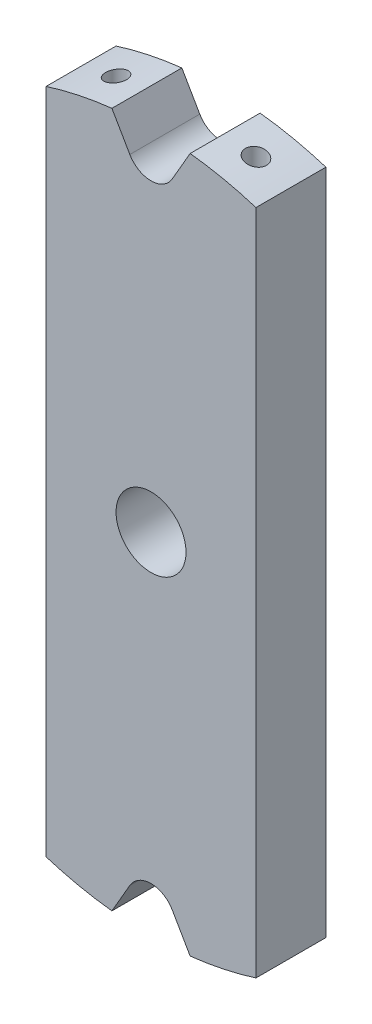
ISO-10303-21;
HEADER;
FILE_DESCRIPTION(('STEP AP214'),'2;1');
FILE_NAME('part.step','',(''),(''),'','','');
FILE_SCHEMA(('AUTOMOTIVE_DESIGN { 1 0 10303 214 1 1 1 1 }'));
ENDSEC;
DATA;
#1=APPLICATION_CONTEXT('core data for automotive mechanical design processes');
#2=APPLICATION_PROTOCOL_DEFINITION('international standard','automotive_design',2000,#1);
#3=PRODUCT_CONTEXT('',#1,'mechanical');
#4=PRODUCT('Part','Part','',(#3));
#5=PRODUCT_RELATED_PRODUCT_CATEGORY('part','',(#4));
#6=PRODUCT_DEFINITION_FORMATION('','',#4);
#7=PRODUCT_DEFINITION_CONTEXT('part definition',#1,'design');
#8=PRODUCT_DEFINITION('design','',#6,#7);
#9=PRODUCT_DEFINITION_SHAPE('','',#8);
#10=(LENGTH_UNIT() NAMED_UNIT(*) SI_UNIT(.MILLI.,.METRE.));
#11=(NAMED_UNIT(*) PLANE_ANGLE_UNIT() SI_UNIT($,.RADIAN.));
#12=(NAMED_UNIT(*) SI_UNIT($,.STERADIAN.) SOLID_ANGLE_UNIT());
#13=UNCERTAINTY_MEASURE_WITH_UNIT(LENGTH_MEASURE(1.E-05),#10,'distance_accuracy_value','');
#14=(GEOMETRIC_REPRESENTATION_CONTEXT(3) GLOBAL_UNCERTAINTY_ASSIGNED_CONTEXT((#13)) GLOBAL_UNIT_ASSIGNED_CONTEXT((#10,
#11,#12)) REPRESENTATION_CONTEXT('',''));
#15=CARTESIAN_POINT('',(0.,0.,0.));
#16=DIRECTION('',(0.,0.,1.));
#17=DIRECTION('',(1.,0.,0.));
#18=AXIS2_PLACEMENT_3D('',#15,#16,#17);
#19=CARTESIAN_POINT('',(0.,-47.,10.));
#20=DIRECTION('',(0.,0.,-1.));
#21=DIRECTION('',(-1.,0.,0.));
#22=AXIS2_PLACEMENT_3D('',#19,#20,#21);
#23=CYLINDRICAL_SURFACE('',#22,3.5);
#24=CARTESIAN_POINT('',(0.,-47.,0.));
#25=DIRECTION('',(0.,0.,1.));
#26=DIRECTION('',(1.,0.,0.));
#27=AXIS2_PLACEMENT_3D('',#24,#25,#26);
#28=CIRCLE('',#27,3.5);
#29=CARTESIAN_POINT('',(3.03108891324553,-45.25,0.));
#30=VERTEX_POINT('',#29);
#31=CARTESIAN_POINT('',(-3.03108891324553,-45.25,0.));
#32=VERTEX_POINT('',#31);
#33=EDGE_CURVE('E182',#30,#32,#28,.T.);
#34=ORIENTED_EDGE('',*,*,#33,.F.);
#35=DIRECTION('',(0.,0.,-1.));
#36=VECTOR('',#35,1.);
#37=CARTESIAN_POINT('',(3.03108891324553,-45.25,10.));
#38=LINE('',#37,#36);
#39=CARTESIAN_POINT('',(3.03108891324553,-45.25,10.));
#40=VERTEX_POINT('',#39);
#41=EDGE_CURVE('E11',#40,#30,#38,.T.);
#42=ORIENTED_EDGE('',*,*,#41,.F.);
#43=CARTESIAN_POINT('',(0.,-47.,10.));
#44=DIRECTION('',(0.,0.,1.));
#45=DIRECTION('',(1.,0.,0.));
#46=AXIS2_PLACEMENT_3D('',#43,#44,#45);
#47=CIRCLE('',#46,3.5);
#48=CARTESIAN_POINT('',(-3.03108891324553,-45.25,10.));
#49=VERTEX_POINT('',#48);
#50=EDGE_CURVE('E170',#40,#49,#47,.T.);
#51=ORIENTED_EDGE('',*,*,#50,.T.);
#52=DIRECTION('',(0.,0.,-1.));
#53=VECTOR('',#52,1.);
#54=CARTESIAN_POINT('',(-3.03108891324553,-45.25,10.));
#55=LINE('',#54,#53);
#56=EDGE_CURVE('E60',#49,#32,#55,.T.);
#57=ORIENTED_EDGE('',*,*,#56,.T.);
#58=EDGE_LOOP('',(#34,#42,#51,#57));
#59=FACE_BOUND('',#58,.T.);
#60=ADVANCED_FACE('F37',(#59),#23,.F.);
#61=CARTESIAN_POINT('',(-17.3205080756888,-10.0000000000001,10.));
#62=DIRECTION('',(0.866025403784438,0.500000000000002,0.));
#63=DIRECTION('',(-0.500000000000002,0.866025403784438,0.));
#64=AXIS2_PLACEMENT_3D('',#61,#62,#63);
#65=PLANE('',#64);
#66=DIRECTION('',(0.500000000000002,-0.866025403784438,0.));
#67=VECTOR('',#66,1.);
#68=CARTESIAN_POINT('',(-17.3205080756888,-10.0000000000001,0.));
#69=LINE('',#68,#67);
#70=CARTESIAN_POINT('',(5.59237039909043,-49.6862696659689,0.));
#71=VERTEX_POINT('',#70);
#72=EDGE_CURVE('E224',#30,#71,#69,.T.);
#73=ORIENTED_EDGE('',*,*,#72,.T.);
#74=DIRECTION('',(0.,0.,-1.));
#75=VECTOR('',#74,1.);
#76=CARTESIAN_POINT('',(5.59237039909043,-49.6862696659689,10.));
#77=LINE('',#76,#75);
#78=CARTESIAN_POINT('',(5.59237039909043,-49.6862696659689,10.));
#79=VERTEX_POINT('',#78);
#80=EDGE_CURVE('E51',#79,#71,#77,.T.);
#81=ORIENTED_EDGE('',*,*,#80,.F.);
#82=DIRECTION('',(0.500000000000002,-0.866025403784438,0.));
#83=VECTOR('',#82,1.);
#84=CARTESIAN_POINT('',(-17.3205080756888,-10.0000000000001,10.));
#85=LINE('',#84,#83);
#86=EDGE_CURVE('E164',#40,#79,#85,.T.);
#87=ORIENTED_EDGE('',*,*,#86,.F.);
#88=ORIENTED_EDGE('',*,*,#41,.T.);
#89=EDGE_LOOP('',(#73,#81,#87,#88));
#90=FACE_BOUND('',#89,.T.);
#91=ADVANCED_FACE('F216',(#90),#65,.F.);
#92=CARTESIAN_POINT('',(0.,0.,10.));
#93=DIRECTION('',(0.,0.,-1.));
#94=DIRECTION('',(-1.,0.,0.));
#95=AXIS2_PLACEMENT_3D('',#92,#93,#94);
#96=CYLINDRICAL_SURFACE('',#95,50.);
#97=CARTESIAN_POINT('',(10.,-48.9897948556635,6.5));
#98=CARTESIAN_POINT('',(10.0858791366832,-48.9722645101697,6.49999635952128));
#99=CARTESIAN_POINT('',(10.171775363064,-48.9544936081864,6.49260226758872));
#100=CARTESIAN_POINT('',(10.3411286938173,-48.9190000824482,6.46322747399532));
#101=CARTESIAN_POINT('',(10.4245825439414,-48.9012775493037,6.44122816049135));
#102=CARTESIAN_POINT('',(10.5866005320511,-48.8664583646854,6.38322024386198));
#103=CARTESIAN_POINT('',(10.6651657898896,-48.849361570243,6.34721486297893));
#104=CARTESIAN_POINT('',(10.8151282587911,-48.8163794425489,6.26213937319581));
#105=CARTESIAN_POINT('',(10.8865275357104,-48.8004937604691,6.21307304457599));
#106=CARTESIAN_POINT('',(11.0195888455761,-48.7706191018605,6.10354533187251));
#107=CARTESIAN_POINT('',(11.0813144698965,-48.7566178320047,6.04316463903699));
#108=CARTESIAN_POINT('',(11.1936978075733,-48.7309394665944,5.91242200892849));
#109=CARTESIAN_POINT('',(11.2443563260133,-48.7192622019842,5.84206079830924));
#110=CARTESIAN_POINT('',(11.3319739958824,-48.6989563703661,5.69499015485189));
#111=CARTESIAN_POINT('',(11.3692088289329,-48.6902666458524,5.61845346265767));
#112=CARTESIAN_POINT('',(11.4302686257909,-48.675968917627,5.45993699606161));
#113=CARTESIAN_POINT('',(11.4540957354442,-48.670360420782,5.37795809501017));
#114=CARTESIAN_POINT('',(11.4871196473488,-48.6625766397147,5.21302096788956));
#115=CARTESIAN_POINT('',(11.4966568090315,-48.6603214952865,5.13013454711988));
#116=CARTESIAN_POINT('',(11.5018688822255,-48.6590898060923,4.96390629057573));
#117=CARTESIAN_POINT('',(11.4975450683311,-48.6601129598683,4.88056449737885));
#118=CARTESIAN_POINT('',(11.4753203607744,-48.6653588041587,4.71685367699029));
#119=CARTESIAN_POINT('',(11.4575848832894,-48.6695425125373,4.6364608465482));
#120=CARTESIAN_POINT('',(11.4093088609983,-48.6808820910527,4.4798422263389));
#121=CARTESIAN_POINT('',(11.3787680772939,-48.6880380166397,4.40361651434425));
#122=CARTESIAN_POINT('',(11.3055766282569,-48.7050854842078,4.2568709445758));
#123=CARTESIAN_POINT('',(11.2628410380735,-48.7149961975756,4.18639572259919));
#124=CARTESIAN_POINT('',(11.1666454346378,-48.737136342327,4.05360556168745));
#125=CARTESIAN_POINT('',(11.1131843440286,-48.749366006638,3.99129144356034));
#126=CARTESIAN_POINT('',(10.9958096234631,-48.7759762744799,3.8751323176183));
#127=CARTESIAN_POINT('',(10.9316941602923,-48.7903978319001,3.82150069015058));
#128=CARTESIAN_POINT('',(10.795695519945,-48.8206698688679,3.72572029550702));
#129=CARTESIAN_POINT('',(10.7238113527117,-48.8365205305004,3.683572994329));
#130=CARTESIAN_POINT('',(10.5724474432344,-48.8695149240269,3.61092945441263));
#131=CARTESIAN_POINT('',(10.4928273148715,-48.8866804950205,3.58073546476346));
#132=CARTESIAN_POINT('',(10.3297112477514,-48.9214065316062,3.5342289525659));
#133=CARTESIAN_POINT('',(10.2462149579455,-48.9389670328909,3.51791768991794));
#134=CARTESIAN_POINT('',(10.0764583822101,-48.9742034276424,3.49948557529662));
#135=CARTESIAN_POINT('',(9.99017578489304,-48.9918775115893,3.49756592895371));
#136=CARTESIAN_POINT('',(9.81842508726328,-49.0265867259597,3.50854590114569));
#137=CARTESIAN_POINT('',(9.73295699753433,-49.0436218480889,3.52144571198219));
#138=CARTESIAN_POINT('',(9.56538904364483,-49.0765791304875,3.56176123191633));
#139=CARTESIAN_POINT('',(9.48328559575749,-49.0925024883476,3.58916103979063));
#140=CARTESIAN_POINT('',(9.32477622025261,-49.1228568538973,3.65778913034384));
#141=CARTESIAN_POINT('',(9.24836994980716,-49.137287951404,3.69901658012162));
#142=CARTESIAN_POINT('',(9.104517257283,-49.1641440413254,3.7935902143637));
#143=CARTESIAN_POINT('',(9.03696796226519,-49.1765925123405,3.84677319580919));
#144=CARTESIAN_POINT('',(8.91176058474239,-49.1994368014648,3.96409788462003));
#145=CARTESIAN_POINT('',(8.85410158990014,-49.209832808918,4.02823858009316));
#146=CARTESIAN_POINT('',(8.75137555093064,-49.2282044283432,4.16448103291895));
#147=CARTESIAN_POINT('',(8.7061105834476,-49.2362182843981,4.23642841574585));
#148=CARTESIAN_POINT('',(8.62830455130649,-49.2499129826269,4.38710606472149));
#149=CARTESIAN_POINT('',(8.59576240246438,-49.2555940235954,4.46583575221327));
#150=CARTESIAN_POINT('',(8.54479980823417,-49.2644604176461,4.62663079364835));
#151=CARTESIAN_POINT('',(8.52618449568467,-49.2676802232981,4.70863252536448));
#152=CARTESIAN_POINT('',(8.50289877509364,-49.2717044052351,4.87464959868988));
#153=CARTESIAN_POINT('',(8.49822765151238,-49.2725089054605,4.95866483675396));
#154=CARTESIAN_POINT('',(8.50295715004735,-49.2716929298714,5.1256429516356));
#155=CARTESIAN_POINT('',(8.51225089738638,-49.2700908717547,5.20860897046305));
#156=CARTESIAN_POINT('',(8.54442614620231,-49.2645211599643,5.37177880875471));
#157=CARTESIAN_POINT('',(8.56730750871162,-49.2605535304846,5.45198265646021));
#158=CARTESIAN_POINT('',(8.62596751232278,-49.2503153827811,5.60740154847636));
#159=CARTESIAN_POINT('',(8.66175110929415,-49.2440439796389,5.68261466263724));
#160=CARTESIAN_POINT('',(8.74512876652254,-49.2293053743931,5.82593696775097));
#161=CARTESIAN_POINT('',(8.79272268540993,-49.2208381985728,5.89404624372296));
#162=CARTESIAN_POINT('',(8.89873500362245,-49.2017828033848,6.02184332688862));
#163=CARTESIAN_POINT('',(8.95723764833153,-49.1911780203213,6.08145874538407));
#164=CARTESIAN_POINT('',(9.08310525326399,-49.1680921477138,6.19004825601408));
#165=CARTESIAN_POINT('',(9.15047295234948,-49.1556104781342,6.23901904703668));
#166=CARTESIAN_POINT('',(9.29317681734923,-49.1288327680158,6.32569839438116));
#167=CARTESIAN_POINT('',(9.36861658145366,-49.1145125069087,6.36322864612664));
#168=CARTESIAN_POINT('',(9.52441028389691,-49.0845380786996,6.42507020798071));
#169=CARTESIAN_POINT('',(9.60475883807431,-49.0688853659247,6.44939572194411));
#170=CARTESIAN_POINT('',(9.73798331829622,-49.0425780240097,6.4778815345245));
#171=CARTESIAN_POINT('',(9.79007003758203,-49.0322075628501,6.48616965076817));
#172=CARTESIAN_POINT('',(9.89476903019442,-49.0111864567158,6.49723001853622));
#173=CARTESIAN_POINT('',(9.94738130728341,-49.0005358097344,6.50000223054445));
#174=CARTESIAN_POINT('',(10.,-48.9897948556635,6.5));
#175=B_SPLINE_CURVE_WITH_KNOTS('',3,(#97,#98,#99,#100,#101,#102,#103,#104,#105,#106,#107,#108,
#109,#110,#111,#112,#113,#114,#115,#116,#117,#118,#119,#120,#121,#122,#123,#124,#125,#126,#127,
#128,#129,#130,#131,#132,#133,#134,#135,#136,#137,#138,#139,#140,#141,#142,#143,#144,#145,#146,
#147,#148,#149,#150,#151,#152,#153,#154,#155,#156,#157,#158,#159,#160,#161,#162,#163,#164,#165,
#166,#167,#168,#169,#170,#171,#172,#173,#174),.UNSPECIFIED.,.T.,.F.,(4,2,2,2,2,2,2,2,2,2,2,2,2,
2,2,2,2,2,2,2,2,2,2,2,2,2,2,2,2,2,2,2,2,2,2,2,2,2,4),(0.,0.262754956183761,0.525845392733657,
0.788875338338123,1.05182923679747,1.31297464985277,1.57410105938678,1.82950966904126,
2.0848773900599,2.33406028359135,2.58322026401755,2.82935629478026,3.0754969177092,
3.32339534846435,3.57131869264088,3.82462768746647,4.07796900257275,4.33735986788656,
4.59677427121445,4.85980883727825,5.12284681659378,5.38559693484838,5.64833122932191,
5.90767603850909,6.1669969113824,6.42189655348526,6.67677446939714,6.92801571975663,
7.17924407756359,7.42855952335793,7.6778724193176,7.92728118089956,8.17668695720117,
8.42810522423618,8.67960135021653,8.9348373595731,9.18979827407029,9.35078875191499,
9.51178038309772),.UNSPECIFIED.);
#176=CARTESIAN_POINT('',(10.,-48.9897948556635,6.5));
#177=VERTEX_POINT('',#176);
#178=EDGE_CURVE('E175',#177,#177,#175,.T.);
#179=ORIENTED_EDGE('',*,*,#178,.T.);
#180=EDGE_LOOP('',(#179));
#181=FACE_BOUND('',#180,.T.);
#182=CARTESIAN_POINT('',(0.,0.,0.));
#183=DIRECTION('',(0.,0.,1.));
#184=DIRECTION('',(1.,0.,0.));
#185=AXIS2_PLACEMENT_3D('',#182,#183,#184);
#186=CIRCLE('',#185,50.);
#187=CARTESIAN_POINT('',(15.,-47.6969600708473,0.));
#188=VERTEX_POINT('',#187);
#189=EDGE_CURVE('E226',#71,#188,#186,.T.);
#190=ORIENTED_EDGE('',*,*,#189,.T.);
#191=DIRECTION('',(0.,0.,-1.));
#192=VECTOR('',#191,1.);
#193=CARTESIAN_POINT('',(15.,-47.6969600708473,10.));
#194=LINE('',#193,#192);
#195=CARTESIAN_POINT('',(15.,-47.6969600708473,10.));
#196=VERTEX_POINT('',#195);
#197=EDGE_CURVE('E263',#196,#188,#194,.T.);
#198=ORIENTED_EDGE('',*,*,#197,.F.);
#199=CARTESIAN_POINT('',(0.,0.,10.));
#200=DIRECTION('',(0.,0.,1.));
#201=DIRECTION('',(1.,0.,0.));
#202=AXIS2_PLACEMENT_3D('',#199,#200,#201);
#203=CIRCLE('',#202,50.);
#204=EDGE_CURVE('E159',#79,#196,#203,.T.);
#205=ORIENTED_EDGE('',*,*,#204,.F.);
#206=ORIENTED_EDGE('',*,*,#80,.T.);
#207=EDGE_LOOP('',(#190,#198,#205,#206));
#208=FACE_BOUND('',#207,.T.);
#209=ADVANCED_FACE('F214',(#181,#208),#96,.T.);
#210=CARTESIAN_POINT('',(15.,0.,10.));
#211=DIRECTION('',(1.,0.,0.));
#212=DIRECTION('',(0.,0.,-1.));
#213=AXIS2_PLACEMENT_3D('',#210,#211,#212);
#214=PLANE('',#213);
#215=DIRECTION('',(0.,-1.,0.));
#216=VECTOR('',#215,1.);
#217=CARTESIAN_POINT('',(15.,0.,0.));
#218=LINE('',#217,#216);
#219=CARTESIAN_POINT('',(15.,47.6969600708473,0.));
#220=VERTEX_POINT('',#219);
#221=EDGE_CURVE('E231',#220,#188,#218,.T.);
#222=ORIENTED_EDGE('',*,*,#221,.F.);
#223=DIRECTION('',(0.,0.,-1.));
#224=VECTOR('',#223,1.);
#225=CARTESIAN_POINT('',(15.,47.6969600708473,10.));
#226=LINE('',#225,#224);
#227=CARTESIAN_POINT('',(15.,47.6969600708473,10.));
#228=VERTEX_POINT('',#227);
#229=EDGE_CURVE('E261',#228,#220,#226,.T.);
#230=ORIENTED_EDGE('',*,*,#229,.F.);
#231=DIRECTION('',(0.,-1.,0.));
#232=VECTOR('',#231,1.);
#233=CARTESIAN_POINT('',(15.,0.,10.));
#234=LINE('',#233,#232);
#235=EDGE_CURVE('E163',#228,#196,#234,.T.);
#236=ORIENTED_EDGE('',*,*,#235,.T.);
#237=ORIENTED_EDGE('',*,*,#197,.T.);
#238=EDGE_LOOP('',(#222,#230,#236,#237));
#239=FACE_BOUND('',#238,.T.);
#240=ADVANCED_FACE('F399',(#239),#214,.T.);
#241=CARTESIAN_POINT('',(0.,0.,10.));
#242=DIRECTION('',(0.,0.,-1.));
#243=DIRECTION('',(-1.,0.,0.));
#244=AXIS2_PLACEMENT_3D('',#241,#242,#243);
#245=CYLINDRICAL_SURFACE('',#244,50.);
#246=CARTESIAN_POINT('',(10.,48.9897948556635,6.5));
#247=CARTESIAN_POINT('',(9.91478887554006,49.0071881811933,6.49999647971611));
#248=CARTESIAN_POINT('',(9.82947274865342,49.0243695659367,6.49271742395125));
#249=CARTESIAN_POINT('',(9.66107570232554,49.0578333106574,6.46370932867217));
#250=CARTESIAN_POINT('',(9.57799742092414,49.0741146315172,6.44196395026409));
#251=CARTESIAN_POINT('',(9.41652208231213,49.1053548559542,6.38451954869199));
#252=CARTESIAN_POINT('',(9.33812559406634,49.1203135989081,6.34881883353796));
#253=CARTESIAN_POINT('',(9.18838467540367,49.14854422101,6.26438380204273));
#254=CARTESIAN_POINT('',(9.1170382563951,49.1618165761361,6.2156531754642));
#255=CARTESIAN_POINT('',(8.98431772906986,49.1862434549037,6.10709344498023));
#256=CARTESIAN_POINT('',(8.92283973739132,49.1974202819408,6.04739642373511));
#257=CARTESIAN_POINT('',(8.81078991056041,49.217610986253,5.91819901467924));
#258=CARTESIAN_POINT('',(8.76021753161179,49.2266249713783,5.84869911596406));
#259=CARTESIAN_POINT('',(8.67232737510407,49.2421841935953,5.70313089654968));
#260=CARTESIAN_POINT('',(8.63480120565231,49.2487683593233,5.6271925318511));
#261=CARTESIAN_POINT('',(8.57301363506163,49.259561788017,5.46994102269112));
#262=CARTESIAN_POINT('',(8.54875117647063,49.2637712403082,5.38862830728046));
#263=CARTESIAN_POINT('',(8.51447377685327,49.2697071016662,5.22403263081471));
#264=CARTESIAN_POINT('',(8.5042842247487,49.2714639447555,5.14078709340706));
#265=CARTESIAN_POINT('',(8.49790291166978,49.2725649590369,4.97374689722054));
#266=CARTESIAN_POINT('',(8.50171055443912,49.2719092330001,4.88995226198407));
#267=CARTESIAN_POINT('',(8.52314690741033,49.2682055854702,4.72465564512902));
#268=CARTESIAN_POINT('',(8.54070283020577,49.2651702621672,4.64314392425489));
#269=CARTESIAN_POINT('',(8.58900623305097,49.2567717985695,4.48425654649366));
#270=CARTESIAN_POINT('',(8.61975371843793,49.2514086573329,4.40688089127999));
#271=CARTESIAN_POINT('',(8.69360927156552,49.2384256503157,4.25821026134585));
#272=CARTESIAN_POINT('',(8.73675165951313,49.2307995165887,4.18693289331001));
#273=CARTESIAN_POINT('',(8.83406582238714,49.2134302433338,4.0526488910847));
#274=CARTESIAN_POINT('',(8.88823803585944,49.2036870196292,3.9896425859166));
#275=CARTESIAN_POINT('',(9.00662904619383,49.1821540974586,3.87297206796926));
#276=CARTESIAN_POINT('',(9.07094559081054,49.1703443508452,3.81941078104238));
#277=CARTESIAN_POINT('',(9.2073373750036,49.1449869654042,3.72382499452799));
#278=CARTESIAN_POINT('',(9.27941319537721,49.1314391964675,3.68180135939377));
#279=CARTESIAN_POINT('',(9.43045983014779,49.1026722544835,3.60977214847654));
#280=CARTESIAN_POINT('',(9.50952095694066,49.0874302263229,3.57996511669569));
#281=CARTESIAN_POINT('',(9.67130669628057,49.0558112655786,3.53404169782797));
#282=CARTESIAN_POINT('',(9.75403164585665,49.0394342285088,3.5179265730007));
#283=CARTESIAN_POINT('',(9.92223683268529,49.0056801861247,3.49959127754888));
#284=CARTESIAN_POINT('',(10.0077400068686,48.9882911870315,3.49760328944522));
#285=CARTESIAN_POINT('',(10.177794242512,48.9532434500547,3.50813936648569));
#286=CARTESIAN_POINT('',(10.2623452310211,48.9355846917448,3.52066453600949));
#287=CARTESIAN_POINT('',(10.4289846852894,48.9003436119754,3.56007808250217));
#288=CARTESIAN_POINT('',(10.5110400542204,48.8827638224671,3.5871088950929));
#289=CARTESIAN_POINT('',(10.6694535694822,48.8484322709889,3.6549145269799));
#290=CARTESIAN_POINT('',(10.7458116544822,48.8316805179335,3.69568949420484));
#291=CARTESIAN_POINT('',(10.8903509269333,48.7996488224022,3.78975843904898));
#292=CARTESIAN_POINT('',(10.9585591393729,48.7843640505829,3.84300920311653));
#293=CARTESIAN_POINT('',(11.0850306972285,48.7557822847538,3.96068922830953));
#294=CARTESIAN_POINT('',(11.1432949452544,48.7424851103441,4.0251174737876));
#295=CARTESIAN_POINT('',(11.2470602023482,48.7186455879108,4.16209329890533));
#296=CARTESIAN_POINT('',(11.2927757456295,48.708057177447,4.23447024596363));
#297=CARTESIAN_POINT('',(11.3713451956066,48.689774533382,4.3862329725378));
#298=CARTESIAN_POINT('',(11.404201131811,48.6820798431002,4.46561764366618));
#299=CARTESIAN_POINT('',(11.4552848942714,48.6700844822706,4.62699917964206));
#300=CARTESIAN_POINT('',(11.4738591829755,48.6657034703804,4.70888046709156));
#301=CARTESIAN_POINT('',(11.4970991515116,48.6602184271968,4.87469838160647));
#302=CARTESIAN_POINT('',(11.5017664833735,48.6591140066717,4.95863476334943));
#303=CARTESIAN_POINT('',(11.4970782220618,48.6602219050326,5.12462685362414));
#304=CARTESIAN_POINT('',(11.4879647119167,48.6623769659467,5.20668991091699));
#305=CARTESIAN_POINT('',(11.456461115543,48.6698033418085,5.36807660393447));
#306=CARTESIAN_POINT('',(11.4340712177784,48.6750746125201,5.44740027852888));
#307=CARTESIAN_POINT('',(11.3767108931329,48.688513137101,5.60117205164938));
#308=CARTESIAN_POINT('',(11.3417293161195,48.6966829575898,5.67561575960253));
#309=CARTESIAN_POINT('',(11.2602751435931,48.7155821552456,5.81755964595221));
#310=CARTESIAN_POINT('',(11.2138020914377,48.7263116341264,5.8850595482684));
#311=CARTESIAN_POINT('',(11.1098026235503,48.7501299974904,6.01253453224992));
#312=CARTESIAN_POINT('',(11.0520918433019,48.7632579719427,6.07235180740386));
#313=CARTESIAN_POINT('',(10.9278330749031,48.7912544843515,6.18151094791257));
#314=CARTESIAN_POINT('',(10.86128186333,48.8061236569533,6.23084897515932));
#315=CARTESIAN_POINT('',(10.7194336434795,48.8374768565917,6.31892412838511));
#316=CARTESIAN_POINT('',(10.6439587541398,48.8539920952489,6.35736338723341));
#317=CARTESIAN_POINT('',(10.4878284039359,48.8877470521233,6.42095586158039));
#318=CARTESIAN_POINT('',(10.4071784210435,48.9049859978043,6.44612287412656));
#319=CARTESIAN_POINT('',(10.2717399946764,48.9335707241887,6.4761934763488));
#320=CARTESIAN_POINT('',(10.2177970565818,48.9448638256713,6.4851078016435));
#321=CARTESIAN_POINT('',(10.1092504803561,48.967398626134,6.49701223426897));
#322=CARTESIAN_POINT('',(10.0546468328677,48.978640324383,6.50000225759684));
#323=CARTESIAN_POINT('',(10.,48.9897948556635,6.5));
#324=B_SPLINE_CURVE_WITH_KNOTS('',3,(#246,#247,#248,#249,#250,#251,#252,#253,#254,#255,#256,
#257,#258,#259,#260,#261,#262,#263,#264,#265,#266,#267,#268,#269,#270,#271,#272,#273,#274,#275,
#276,#277,#278,#279,#280,#281,#282,#283,#284,#285,#286,#287,#288,#289,#290,#291,#292,#293,#294,
#295,#296,#297,#298,#299,#300,#301,#302,#303,#304,#305,#306,#307,#308,#309,#310,#311,#312,#313,
#314,#315,#316,#317,#318,#319,#320,#321,#322,#323),.UNSPECIFIED.,.T.,.F.,(4,2,2,2,2,2,2,2,2,2,2,
2,2,2,2,2,2,2,2,2,2,2,2,2,2,2,2,2,2,2,2,2,2,2,2,2,2,2,4),(0.,0.260704172880814,
0.521703297429954,0.782734076174067,1.0436910153161,1.3016895713054,1.55967525950698,
1.81332705298739,2.06695862107605,2.31741406537969,2.5678588408379,2.8169865795378,
3.0661144190324,3.3159388279527,3.5657731718326,3.81818123120511,4.07060819697824,
4.32698884109619,4.58339311843225,4.84400190946332,5.10463053283968,5.36786647783089,
5.63110525612741,5.89344537010953,6.1557616589006,6.4132657359251,6.6707291571463,
6.92173031678122,7.17270165839014,7.41931520245745,7.66592524582648,7.9127542057235,
8.1595929755592,8.41088698352997,8.66227287182458,8.9199820193061,9.17742273677064,
9.34461282432342,9.51180528251023),.UNSPECIFIED.);
#325=CARTESIAN_POINT('',(10.,48.9897948556635,6.5));
#326=VERTEX_POINT('',#325);
#327=EDGE_CURVE('E40',#326,#326,#324,.T.);
#328=ORIENTED_EDGE('',*,*,#327,.T.);
#329=EDGE_LOOP('',(#328));
#330=FACE_BOUND('',#329,.T.);
#331=CARTESIAN_POINT('',(0.,0.,0.));
#332=DIRECTION('',(0.,0.,1.));
#333=DIRECTION('',(1.,0.,0.));
#334=AXIS2_PLACEMENT_3D('',#331,#332,#333);
#335=CIRCLE('',#334,50.);
#336=CARTESIAN_POINT('',(5.59237039909043,49.6862696659689,0.));
#337=VERTEX_POINT('',#336);
#338=EDGE_CURVE('E235',#220,#337,#335,.T.);
#339=ORIENTED_EDGE('',*,*,#338,.T.);
#340=DIRECTION('',(0.,0.,-1.));
#341=VECTOR('',#340,1.);
#342=CARTESIAN_POINT('',(5.59237039909043,49.6862696659689,10.));
#343=LINE('',#342,#341);
#344=CARTESIAN_POINT('',(5.59237039909043,49.6862696659689,10.));
#345=VERTEX_POINT('',#344);
#346=EDGE_CURVE('E259',#345,#337,#343,.T.);
#347=ORIENTED_EDGE('',*,*,#346,.F.);
#348=CARTESIAN_POINT('',(0.,0.,10.));
#349=DIRECTION('',(0.,0.,1.));
#350=DIRECTION('',(1.,0.,0.));
#351=AXIS2_PLACEMENT_3D('',#348,#349,#350);
#352=CIRCLE('',#351,50.);
#353=EDGE_CURVE('E169',#228,#345,#352,.T.);
#354=ORIENTED_EDGE('',*,*,#353,.F.);
#355=ORIENTED_EDGE('',*,*,#229,.T.);
#356=EDGE_LOOP('',(#339,#347,#354,#355));
#357=FACE_BOUND('',#356,.T.);
#358=ADVANCED_FACE('F358',(#330,#357),#245,.T.);
#359=CARTESIAN_POINT('',(-17.3205080756888,10.0000000000001,10.));
#360=DIRECTION('',(-0.866025403784438,0.500000000000002,0.));
#361=DIRECTION('',(-0.500000000000002,-0.866025403784438,0.));
#362=AXIS2_PLACEMENT_3D('',#359,#360,#361);
#363=PLANE('',#362);
#364=DIRECTION('',(0.500000000000002,0.866025403784438,0.));
#365=VECTOR('',#364,1.);
#366=CARTESIAN_POINT('',(-17.3205080756888,10.0000000000001,0.));
#367=LINE('',#366,#365);
#368=CARTESIAN_POINT('',(3.03108891324553,45.25,0.));
#369=VERTEX_POINT('',#368);
#370=EDGE_CURVE('E238',#369,#337,#367,.T.);
#371=ORIENTED_EDGE('',*,*,#370,.F.);
#372=DIRECTION('',(0.,0.,-1.));
#373=VECTOR('',#372,1.);
#374=CARTESIAN_POINT('',(3.03108891324553,45.25,10.));
#375=LINE('',#374,#373);
#376=CARTESIAN_POINT('',(3.03108891324553,45.25,10.));
#377=VERTEX_POINT('',#376);
#378=EDGE_CURVE('E257',#377,#369,#375,.T.);
#379=ORIENTED_EDGE('',*,*,#378,.F.);
#380=DIRECTION('',(0.500000000000002,0.866025403784438,0.));
#381=VECTOR('',#380,1.);
#382=CARTESIAN_POINT('',(-17.3205080756888,10.0000000000001,10.));
#383=LINE('',#382,#381);
#384=EDGE_CURVE('E451',#377,#345,#383,.T.);
#385=ORIENTED_EDGE('',*,*,#384,.T.);
#386=ORIENTED_EDGE('',*,*,#346,.T.);
#387=EDGE_LOOP('',(#371,#379,#385,#386));
#388=FACE_BOUND('',#387,.T.);
#389=ADVANCED_FACE('F378',(#388),#363,.T.);
#390=CARTESIAN_POINT('',(0.,47.,10.));
#391=DIRECTION('',(0.,0.,-1.));
#392=DIRECTION('',(-1.,0.,0.));
#393=AXIS2_PLACEMENT_3D('',#390,#391,#392);
#394=CYLINDRICAL_SURFACE('',#393,3.5);
#395=CARTESIAN_POINT('',(0.,47.,0.));
#396=DIRECTION('',(0.,0.,1.));
#397=DIRECTION('',(1.,0.,0.));
#398=AXIS2_PLACEMENT_3D('',#395,#396,#397);
#399=CIRCLE('',#398,3.5);
#400=CARTESIAN_POINT('',(-3.03108891324553,45.25,0.));
#401=VERTEX_POINT('',#400);
#402=EDGE_CURVE('E242',#369,#401,#399,.F.);
#403=ORIENTED_EDGE('',*,*,#402,.T.);
#404=DIRECTION('',(0.,0.,-1.));
#405=VECTOR('',#404,1.);
#406=CARTESIAN_POINT('',(-3.03108891324553,45.25,10.));
#407=LINE('',#406,#405);
#408=CARTESIAN_POINT('',(-3.03108891324553,45.25,10.));
#409=VERTEX_POINT('',#408);
#410=EDGE_CURVE('E254',#409,#401,#407,.T.);
#411=ORIENTED_EDGE('',*,*,#410,.F.);
#412=CARTESIAN_POINT('',(0.,47.,10.));
#413=DIRECTION('',(0.,0.,1.));
#414=DIRECTION('',(1.,0.,0.));
#415=AXIS2_PLACEMENT_3D('',#412,#413,#414);
#416=CIRCLE('',#415,3.5);
#417=EDGE_CURVE('E456',#377,#409,#416,.F.);
#418=ORIENTED_EDGE('',*,*,#417,.F.);
#419=ORIENTED_EDGE('',*,*,#378,.T.);
#420=EDGE_LOOP('',(#403,#411,#418,#419));
#421=FACE_BOUND('',#420,.T.);
#422=ADVANCED_FACE('F367',(#421),#394,.F.);
#423=CARTESIAN_POINT('',(17.3205080756888,10.,10.));
#424=DIRECTION('',(-0.866025403784439,-0.5,0.));
#425=DIRECTION('',(0.5,-0.866025403784439,0.));
#426=AXIS2_PLACEMENT_3D('',#423,#424,#425);
#427=PLANE('',#426);
#428=DIRECTION('',(-0.5,0.866025403784439,0.));
#429=VECTOR('',#428,1.);
#430=CARTESIAN_POINT('',(17.3205080756888,10.,0.));
#431=LINE('',#430,#429);
#432=CARTESIAN_POINT('',(-5.59237039909043,49.6862696659689,0.));
#433=VERTEX_POINT('',#432);
#434=EDGE_CURVE('E244',#401,#433,#431,.T.);
#435=ORIENTED_EDGE('',*,*,#434,.T.);
#436=DIRECTION('',(0.,0.,-1.));
#437=VECTOR('',#436,1.);
#438=CARTESIAN_POINT('',(-5.59237039909043,49.6862696659689,10.));
#439=LINE('',#438,#437);
#440=CARTESIAN_POINT('',(-5.59237039909043,49.6862696659689,10.));
#441=VERTEX_POINT('',#440);
#442=EDGE_CURVE('E251',#441,#433,#439,.T.);
#443=ORIENTED_EDGE('',*,*,#442,.F.);
#444=DIRECTION('',(-0.5,0.866025403784439,0.));
#445=VECTOR('',#444,1.);
#446=CARTESIAN_POINT('',(17.3205080756888,10.,10.));
#447=LINE('',#446,#445);
#448=EDGE_CURVE('E458',#409,#441,#447,.T.);
#449=ORIENTED_EDGE('',*,*,#448,.F.);
#450=ORIENTED_EDGE('',*,*,#410,.T.);
#451=EDGE_LOOP('',(#435,#443,#449,#450));
#452=FACE_BOUND('',#451,.T.);
#453=ADVANCED_FACE('F356',(#452),#427,.F.);
#454=CARTESIAN_POINT('',(-10.,48.9897948556635,6.5));
#455=CARTESIAN_POINT('',(-10.0858791366832,48.9722645101697,6.49999635952128));
#456=CARTESIAN_POINT('',(-10.171775363064,48.9544936081864,6.49260226758872));
#457=CARTESIAN_POINT('',(-10.3411286938173,48.9190000824482,6.46322747399532));
#458=CARTESIAN_POINT('',(-10.4245825439414,48.9012775493037,6.44122816049135));
#459=CARTESIAN_POINT('',(-10.5866005320511,48.8664583646854,6.38322024386198));
#460=CARTESIAN_POINT('',(-10.6651657898896,48.849361570243,6.34721486297893));
#461=CARTESIAN_POINT('',(-10.8151282587911,48.8163794425489,6.26213937319581));
#462=CARTESIAN_POINT('',(-10.8865275357104,48.8004937604691,6.21307304457599));
#463=CARTESIAN_POINT('',(-11.0195888455761,48.7706191018605,6.10354533187251));
#464=CARTESIAN_POINT('',(-11.0813144698965,48.7566178320047,6.04316463903699));
#465=CARTESIAN_POINT('',(-11.1936978075733,48.7309394665944,5.91242200892849));
#466=CARTESIAN_POINT('',(-11.2443563260133,48.7192622019842,5.84206079830924));
#467=CARTESIAN_POINT('',(-11.3319739958824,48.6989563703661,5.69499015485189));
#468=CARTESIAN_POINT('',(-11.3692088289329,48.6902666458524,5.61845346265767));
#469=CARTESIAN_POINT('',(-11.4302686257909,48.675968917627,5.45993699606161));
#470=CARTESIAN_POINT('',(-11.4540957354442,48.670360420782,5.37795809501017));
#471=CARTESIAN_POINT('',(-11.4871196473488,48.6625766397147,5.21302096788956));
#472=CARTESIAN_POINT('',(-11.4966568090315,48.6603214952865,5.13013454711988));
#473=CARTESIAN_POINT('',(-11.5018688822255,48.6590898060923,4.96390629057573));
#474=CARTESIAN_POINT('',(-11.4975450683311,48.6601129598683,4.88056449737885));
#475=CARTESIAN_POINT('',(-11.4753203607744,48.6653588041587,4.71685367699029));
#476=CARTESIAN_POINT('',(-11.4575848832894,48.6695425125373,4.6364608465482));
#477=CARTESIAN_POINT('',(-11.4093088609983,48.6808820910527,4.4798422263389));
#478=CARTESIAN_POINT('',(-11.3787680772939,48.6880380166397,4.40361651434425));
#479=CARTESIAN_POINT('',(-11.3055766282569,48.7050854842078,4.2568709445758));
#480=CARTESIAN_POINT('',(-11.2628410380735,48.7149961975756,4.18639572259919));
#481=CARTESIAN_POINT('',(-11.1666454346378,48.737136342327,4.05360556168745));
#482=CARTESIAN_POINT('',(-11.1131843440286,48.749366006638,3.99129144356034));
#483=CARTESIAN_POINT('',(-10.9958096234631,48.7759762744799,3.8751323176183));
#484=CARTESIAN_POINT('',(-10.9316941602923,48.7903978319001,3.82150069015058));
#485=CARTESIAN_POINT('',(-10.795695519945,48.8206698688679,3.72572029550702));
#486=CARTESIAN_POINT('',(-10.7238113527117,48.8365205305004,3.683572994329));
#487=CARTESIAN_POINT('',(-10.5724474432344,48.8695149240269,3.61092945441263));
#488=CARTESIAN_POINT('',(-10.4928273148715,48.8866804950205,3.58073546476346));
#489=CARTESIAN_POINT('',(-10.3297112477514,48.9214065316062,3.5342289525659));
#490=CARTESIAN_POINT('',(-10.2462149579455,48.9389670328909,3.51791768991794));
#491=CARTESIAN_POINT('',(-10.0764583822101,48.9742034276424,3.49948557529662));
#492=CARTESIAN_POINT('',(-9.99017578489304,48.9918775115893,3.49756592895371));
#493=CARTESIAN_POINT('',(-9.81842508726328,49.0265867259597,3.50854590114569));
#494=CARTESIAN_POINT('',(-9.73295699753433,49.0436218480889,3.52144571198219));
#495=CARTESIAN_POINT('',(-9.56538904364483,49.0765791304875,3.56176123191633));
#496=CARTESIAN_POINT('',(-9.48328559575749,49.0925024883476,3.58916103979063));
#497=CARTESIAN_POINT('',(-9.32477622025261,49.1228568538973,3.65778913034384));
#498=CARTESIAN_POINT('',(-9.24836994980716,49.137287951404,3.69901658012162));
#499=CARTESIAN_POINT('',(-9.104517257283,49.1641440413254,3.7935902143637));
#500=CARTESIAN_POINT('',(-9.03696796226519,49.1765925123405,3.84677319580919));
#501=CARTESIAN_POINT('',(-8.91176058474239,49.1994368014648,3.96409788462003));
#502=CARTESIAN_POINT('',(-8.85410158990014,49.209832808918,4.02823858009316));
#503=CARTESIAN_POINT('',(-8.75137555093064,49.2282044283432,4.16448103291895));
#504=CARTESIAN_POINT('',(-8.7061105834476,49.2362182843981,4.23642841574585));
#505=CARTESIAN_POINT('',(-8.62830455130649,49.2499129826269,4.38710606472149));
#506=CARTESIAN_POINT('',(-8.59576240246438,49.2555940235954,4.46583575221327));
#507=CARTESIAN_POINT('',(-8.54479980823417,49.2644604176461,4.62663079364835));
#508=CARTESIAN_POINT('',(-8.52618449568467,49.2676802232981,4.70863252536448));
#509=CARTESIAN_POINT('',(-8.50289877509364,49.2717044052351,4.87464959868988));
#510=CARTESIAN_POINT('',(-8.49822765151238,49.2725089054605,4.95866483675396));
#511=CARTESIAN_POINT('',(-8.50295715004735,49.2716929298714,5.1256429516356));
#512=CARTESIAN_POINT('',(-8.51225089738638,49.2700908717547,5.20860897046305));
#513=CARTESIAN_POINT('',(-8.54442614620231,49.2645211599643,5.37177880875471));
#514=CARTESIAN_POINT('',(-8.56730750871162,49.2605535304846,5.45198265646021));
#515=CARTESIAN_POINT('',(-8.62596751232278,49.2503153827811,5.60740154847636));
#516=CARTESIAN_POINT('',(-8.66175110929415,49.2440439796389,5.68261466263724));
#517=CARTESIAN_POINT('',(-8.74512876652254,49.2293053743931,5.82593696775097));
#518=CARTESIAN_POINT('',(-8.79272268540993,49.2208381985728,5.89404624372296));
#519=CARTESIAN_POINT('',(-8.89873500362245,49.2017828033848,6.02184332688862));
#520=CARTESIAN_POINT('',(-8.95723764833153,49.1911780203213,6.08145874538407));
#521=CARTESIAN_POINT('',(-9.08310525326399,49.1680921477138,6.19004825601408));
#522=CARTESIAN_POINT('',(-9.15047295234948,49.1556104781342,6.23901904703668));
#523=CARTESIAN_POINT('',(-9.29317681734923,49.1288327680158,6.32569839438116));
#524=CARTESIAN_POINT('',(-9.36861658145366,49.1145125069087,6.36322864612664));
#525=CARTESIAN_POINT('',(-9.52441028389691,49.0845380786996,6.42507020798071));
#526=CARTESIAN_POINT('',(-9.60475883807431,49.0688853659247,6.44939572194411));
#527=CARTESIAN_POINT('',(-9.73798331829622,49.0425780240097,6.4778815345245));
#528=CARTESIAN_POINT('',(-9.79007003758203,49.0322075628501,6.48616965076817));
#529=CARTESIAN_POINT('',(-9.89476903019442,49.0111864567158,6.49723001853622));
#530=CARTESIAN_POINT('',(-9.94738130728341,49.0005358097344,6.50000223054445));
#531=CARTESIAN_POINT('',(-10.,48.9897948556635,6.5));
#532=B_SPLINE_CURVE_WITH_KNOTS('',3,(#454,#455,#456,#457,#458,#459,#460,#461,#462,#463,#464,
#465,#466,#467,#468,#469,#470,#471,#472,#473,#474,#475,#476,#477,#478,#479,#480,#481,#482,#483,
#484,#485,#486,#487,#488,#489,#490,#491,#492,#493,#494,#495,#496,#497,#498,#499,#500,#501,#502,
#503,#504,#505,#506,#507,#508,#509,#510,#511,#512,#513,#514,#515,#516,#517,#518,#519,#520,#521,
#522,#523,#524,#525,#526,#527,#528,#529,#530,#531),.UNSPECIFIED.,.T.,.F.,(4,2,2,2,2,2,2,2,2,2,2,
2,2,2,2,2,2,2,2,2,2,2,2,2,2,2,2,2,2,2,2,2,2,2,2,2,2,2,4),(0.,0.262754956183761,
0.525845392733657,0.788875338338123,1.05182923679747,1.31297464985277,1.57410105938678,
1.82950966904126,2.0848773900599,2.33406028359135,2.58322026401755,2.82935629478026,
3.0754969177092,3.32339534846435,3.57131869264088,3.82462768746647,4.07796900257275,
4.33735986788656,4.59677427121445,4.85980883727825,5.12284681659378,5.38559693484838,
5.64833122932191,5.90767603850909,6.1669969113824,6.42189655348526,6.67677446939714,
6.92801571975663,7.17924407756359,7.42855952335793,7.6778724193176,7.92728118089956,
8.17668695720117,8.42810522423618,8.67960135021653,8.9348373595731,9.18979827407029,
9.35078875191499,9.51178038309772),.UNSPECIFIED.);
#533=CARTESIAN_POINT('',(-10.,48.9897948556635,6.5));
#534=VERTEX_POINT('',#533);
#535=EDGE_CURVE('E183',#534,#534,#532,.T.);
#536=ORIENTED_EDGE('',*,*,#535,.T.);
#537=EDGE_LOOP('',(#536));
#538=FACE_BOUND('',#537,.T.);
#539=CARTESIAN_POINT('',(-15.,47.6969600708473,0.));
#540=VERTEX_POINT('',#539);
#541=EDGE_CURVE('E239',#433,#540,#335,.T.);
#542=ORIENTED_EDGE('',*,*,#541,.T.);
#543=DIRECTION('',(0.,0.,-1.));
#544=VECTOR('',#543,1.);
#545=CARTESIAN_POINT('',(-15.,47.6969600708473,10.));
#546=LINE('',#545,#544);
#547=CARTESIAN_POINT('',(-15.,47.6969600708473,10.));
#548=VERTEX_POINT('',#547);
#549=EDGE_CURVE('E154',#548,#540,#546,.T.);
#550=ORIENTED_EDGE('',*,*,#549,.F.);
#551=EDGE_CURVE('E142',#441,#548,#352,.T.);
#552=ORIENTED_EDGE('',*,*,#551,.F.);
#553=ORIENTED_EDGE('',*,*,#442,.T.);
#554=EDGE_LOOP('',(#542,#550,#552,#553));
#555=FACE_BOUND('',#554,.T.);
#556=ADVANCED_FACE('F347',(#538,#555),#245,.T.);
#557=CARTESIAN_POINT('',(-15.,0.,10.));
#558=DIRECTION('',(1.,0.,0.));
#559=DIRECTION('',(0.,0.,-1.));
#560=AXIS2_PLACEMENT_3D('',#557,#558,#559);
#561=PLANE('',#560);
#562=DIRECTION('',(0.,-1.,0.));
#563=VECTOR('',#562,1.);
#564=CARTESIAN_POINT('',(-15.,0.,0.));
#565=LINE('',#564,#563);
#566=CARTESIAN_POINT('',(-15.,-47.6969600708473,0.));
#567=VERTEX_POINT('',#566);
#568=EDGE_CURVE('E151',#540,#567,#565,.T.);
#569=ORIENTED_EDGE('',*,*,#568,.T.);
#570=DIRECTION('',(0.,0.,-1.));
#571=VECTOR('',#570,1.);
#572=CARTESIAN_POINT('',(-15.,-47.6969600708473,10.));
#573=LINE('',#572,#571);
#574=CARTESIAN_POINT('',(-15.,-47.6969600708473,10.));
#575=VERTEX_POINT('',#574);
#576=EDGE_CURVE('E148',#575,#567,#573,.T.);
#577=ORIENTED_EDGE('',*,*,#576,.F.);
#578=DIRECTION('',(0.,-1.,0.));
#579=VECTOR('',#578,1.);
#580=CARTESIAN_POINT('',(-15.,0.,10.));
#581=LINE('',#580,#579);
#582=EDGE_CURVE('E134',#548,#575,#581,.T.);
#583=ORIENTED_EDGE('',*,*,#582,.F.);
#584=ORIENTED_EDGE('',*,*,#549,.T.);
#585=EDGE_LOOP('',(#569,#577,#583,#584));
#586=FACE_BOUND('',#585,.T.);
#587=ADVANCED_FACE('F149',(#586),#561,.F.);
#588=CARTESIAN_POINT('',(-10.,-48.9897948556635,6.5));
#589=CARTESIAN_POINT('',(-9.91478887554006,-49.0071881811933,6.49999647971611));
#590=CARTESIAN_POINT('',(-9.82947274865342,-49.0243695659367,6.49271742395125));
#591=CARTESIAN_POINT('',(-9.66107570232554,-49.0578333106574,6.46370932867217));
#592=CARTESIAN_POINT('',(-9.57799742092414,-49.0741146315172,6.44196395026409));
#593=CARTESIAN_POINT('',(-9.41652208231213,-49.1053548559542,6.38451954869199));
#594=CARTESIAN_POINT('',(-9.33812559406634,-49.1203135989081,6.34881883353796));
#595=CARTESIAN_POINT('',(-9.18838467540367,-49.14854422101,6.26438380204273));
#596=CARTESIAN_POINT('',(-9.1170382563951,-49.1618165761361,6.2156531754642));
#597=CARTESIAN_POINT('',(-8.98431772906986,-49.1862434549037,6.10709344498023));
#598=CARTESIAN_POINT('',(-8.92283973739132,-49.1974202819408,6.04739642373511));
#599=CARTESIAN_POINT('',(-8.81078991056041,-49.217610986253,5.91819901467924));
#600=CARTESIAN_POINT('',(-8.76021753161179,-49.2266249713783,5.84869911596406));
#601=CARTESIAN_POINT('',(-8.67232737510407,-49.2421841935953,5.70313089654968));
#602=CARTESIAN_POINT('',(-8.63480120565231,-49.2487683593233,5.6271925318511));
#603=CARTESIAN_POINT('',(-8.57301363506163,-49.259561788017,5.46994102269112));
#604=CARTESIAN_POINT('',(-8.54875117647063,-49.2637712403082,5.38862830728046));
#605=CARTESIAN_POINT('',(-8.51447377685327,-49.2697071016662,5.22403263081471));
#606=CARTESIAN_POINT('',(-8.5042842247487,-49.2714639447555,5.14078709340706));
#607=CARTESIAN_POINT('',(-8.49790291166978,-49.2725649590369,4.97374689722054));
#608=CARTESIAN_POINT('',(-8.50171055443912,-49.2719092330001,4.88995226198407));
#609=CARTESIAN_POINT('',(-8.52314690741033,-49.2682055854702,4.72465564512902));
#610=CARTESIAN_POINT('',(-8.54070283020577,-49.2651702621672,4.64314392425489));
#611=CARTESIAN_POINT('',(-8.58900623305097,-49.2567717985695,4.48425654649366));
#612=CARTESIAN_POINT('',(-8.61975371843793,-49.2514086573329,4.40688089127999));
#613=CARTESIAN_POINT('',(-8.69360927156552,-49.2384256503157,4.25821026134585));
#614=CARTESIAN_POINT('',(-8.73675165951313,-49.2307995165887,4.18693289331001));
#615=CARTESIAN_POINT('',(-8.83406582238714,-49.2134302433338,4.0526488910847));
#616=CARTESIAN_POINT('',(-8.88823803585944,-49.2036870196292,3.9896425859166));
#617=CARTESIAN_POINT('',(-9.00662904619383,-49.1821540974586,3.87297206796926));
#618=CARTESIAN_POINT('',(-9.07094559081054,-49.1703443508452,3.81941078104238));
#619=CARTESIAN_POINT('',(-9.2073373750036,-49.1449869654042,3.72382499452799));
#620=CARTESIAN_POINT('',(-9.27941319537721,-49.1314391964675,3.68180135939377));
#621=CARTESIAN_POINT('',(-9.43045983014779,-49.1026722544835,3.60977214847654));
#622=CARTESIAN_POINT('',(-9.50952095694066,-49.0874302263229,3.57996511669569));
#623=CARTESIAN_POINT('',(-9.67130669628057,-49.0558112655786,3.53404169782797));
#624=CARTESIAN_POINT('',(-9.75403164585665,-49.0394342285088,3.5179265730007));
#625=CARTESIAN_POINT('',(-9.92223683268529,-49.0056801861247,3.49959127754888));
#626=CARTESIAN_POINT('',(-10.0077400068686,-48.9882911870315,3.49760328944522));
#627=CARTESIAN_POINT('',(-10.177794242512,-48.9532434500547,3.50813936648569));
#628=CARTESIAN_POINT('',(-10.2623452310211,-48.9355846917448,3.52066453600949));
#629=CARTESIAN_POINT('',(-10.4289846852894,-48.9003436119754,3.56007808250217));
#630=CARTESIAN_POINT('',(-10.5110400542204,-48.8827638224671,3.5871088950929));
#631=CARTESIAN_POINT('',(-10.6694535694822,-48.8484322709889,3.6549145269799));
#632=CARTESIAN_POINT('',(-10.7458116544822,-48.8316805179335,3.69568949420484));
#633=CARTESIAN_POINT('',(-10.8903509269333,-48.7996488224022,3.78975843904898));
#634=CARTESIAN_POINT('',(-10.9585591393729,-48.7843640505829,3.84300920311653));
#635=CARTESIAN_POINT('',(-11.0850306972285,-48.7557822847538,3.96068922830953));
#636=CARTESIAN_POINT('',(-11.1432949452544,-48.7424851103441,4.0251174737876));
#637=CARTESIAN_POINT('',(-11.2470602023482,-48.7186455879108,4.16209329890533));
#638=CARTESIAN_POINT('',(-11.2927757456295,-48.708057177447,4.23447024596363));
#639=CARTESIAN_POINT('',(-11.3713451956066,-48.689774533382,4.3862329725378));
#640=CARTESIAN_POINT('',(-11.404201131811,-48.6820798431002,4.46561764366618));
#641=CARTESIAN_POINT('',(-11.4552848942714,-48.6700844822706,4.62699917964206));
#642=CARTESIAN_POINT('',(-11.4738591829755,-48.6657034703804,4.70888046709156));
#643=CARTESIAN_POINT('',(-11.4970991515116,-48.6602184271968,4.87469838160647));
#644=CARTESIAN_POINT('',(-11.5017664833735,-48.6591140066717,4.95863476334943));
#645=CARTESIAN_POINT('',(-11.4970782220618,-48.6602219050326,5.12462685362414));
#646=CARTESIAN_POINT('',(-11.4879647119167,-48.6623769659467,5.20668991091699));
#647=CARTESIAN_POINT('',(-11.456461115543,-48.6698033418085,5.36807660393447));
#648=CARTESIAN_POINT('',(-11.4340712177784,-48.6750746125201,5.44740027852888));
#649=CARTESIAN_POINT('',(-11.3767108931329,-48.688513137101,5.60117205164938));
#650=CARTESIAN_POINT('',(-11.3417293161195,-48.6966829575898,5.67561575960253));
#651=CARTESIAN_POINT('',(-11.2602751435931,-48.7155821552456,5.81755964595221));
#652=CARTESIAN_POINT('',(-11.2138020914377,-48.7263116341264,5.8850595482684));
#653=CARTESIAN_POINT('',(-11.1098026235503,-48.7501299974904,6.01253453224992));
#654=CARTESIAN_POINT('',(-11.0520918433019,-48.7632579719427,6.07235180740386));
#655=CARTESIAN_POINT('',(-10.9278330749031,-48.7912544843515,6.18151094791257));
#656=CARTESIAN_POINT('',(-10.86128186333,-48.8061236569533,6.23084897515932));
#657=CARTESIAN_POINT('',(-10.7194336434795,-48.8374768565917,6.31892412838511));
#658=CARTESIAN_POINT('',(-10.6439587541398,-48.8539920952489,6.35736338723341));
#659=CARTESIAN_POINT('',(-10.4878284039359,-48.8877470521233,6.42095586158039));
#660=CARTESIAN_POINT('',(-10.4071784210435,-48.9049859978043,6.44612287412656));
#661=CARTESIAN_POINT('',(-10.2717399946764,-48.9335707241887,6.4761934763488));
#662=CARTESIAN_POINT('',(-10.2177970565818,-48.9448638256713,6.4851078016435));
#663=CARTESIAN_POINT('',(-10.1092504803561,-48.967398626134,6.49701223426897));
#664=CARTESIAN_POINT('',(-10.0546468328677,-48.978640324383,6.50000225759684));
#665=CARTESIAN_POINT('',(-10.,-48.9897948556635,6.5));
#666=B_SPLINE_CURVE_WITH_KNOTS('',3,(#588,#589,#590,#591,#592,#593,#594,#595,#596,#597,#598,
#599,#600,#601,#602,#603,#604,#605,#606,#607,#608,#609,#610,#611,#612,#613,#614,#615,#616,#617,
#618,#619,#620,#621,#622,#623,#624,#625,#626,#627,#628,#629,#630,#631,#632,#633,#634,#635,#636,
#637,#638,#639,#640,#641,#642,#643,#644,#645,#646,#647,#648,#649,#650,#651,#652,#653,#654,#655,
#656,#657,#658,#659,#660,#661,#662,#663,#664,#665),.UNSPECIFIED.,.T.,.F.,(4,2,2,2,2,2,2,2,2,2,2,
2,2,2,2,2,2,2,2,2,2,2,2,2,2,2,2,2,2,2,2,2,2,2,2,2,2,2,4),(0.,0.260704172880814,
0.521703297429954,0.782734076174067,1.0436910153161,1.3016895713054,1.55967525950698,
1.81332705298739,2.06695862107605,2.31741406537969,2.5678588408379,2.8169865795378,
3.0661144190324,3.3159388279527,3.5657731718326,3.81818123120511,4.07060819697824,
4.32698884109619,4.58339311843225,4.84400190946332,5.10463053283968,5.36786647783089,
5.63110525612741,5.89344537010953,6.1557616589006,6.4132657359251,6.6707291571463,
6.92173031678122,7.17270165839014,7.41931520245745,7.66592524582648,7.9127542057235,
8.1595929755592,8.41088698352997,8.66227287182458,8.9199820193061,9.17742273677064,
9.34461282432342,9.51180528251023),.UNSPECIFIED.);
#667=CARTESIAN_POINT('',(-10.,-48.9897948556635,6.5));
#668=VERTEX_POINT('',#667);
#669=EDGE_CURVE('E266',#668,#668,#666,.T.);
#670=ORIENTED_EDGE('',*,*,#669,.T.);
#671=EDGE_LOOP('',(#670));
#672=FACE_BOUND('',#671,.T.);
#673=CARTESIAN_POINT('',(-5.59237039909043,-49.6862696659689,0.));
#674=VERTEX_POINT('',#673);
#675=EDGE_CURVE('E232',#567,#674,#186,.T.);
#676=ORIENTED_EDGE('',*,*,#675,.T.);
#677=DIRECTION('',(0.,0.,-1.));
#678=VECTOR('',#677,1.);
#679=CARTESIAN_POINT('',(-5.59237039909043,-49.6862696659689,10.));
#680=LINE('',#679,#678);
#681=CARTESIAN_POINT('',(-5.59237039909043,-49.6862696659689,10.));
#682=VERTEX_POINT('',#681);
#683=EDGE_CURVE('E98',#682,#674,#680,.T.);
#684=ORIENTED_EDGE('',*,*,#683,.F.);
#685=EDGE_CURVE('E140',#575,#682,#203,.T.);
#686=ORIENTED_EDGE('',*,*,#685,.F.);
#687=ORIENTED_EDGE('',*,*,#576,.T.);
#688=EDGE_LOOP('',(#676,#684,#686,#687));
#689=FACE_BOUND('',#688,.T.);
#690=ADVANCED_FACE('F156',(#672,#689),#96,.T.);
#691=CARTESIAN_POINT('',(17.3205080756888,-10.,10.));
#692=DIRECTION('',(0.866025403784439,-0.5,0.));
#693=DIRECTION('',(0.5,0.866025403784439,0.));
#694=AXIS2_PLACEMENT_3D('',#691,#692,#693);
#695=PLANE('',#694);
#696=DIRECTION('',(-0.5,-0.866025403784439,0.));
#697=VECTOR('',#696,1.);
#698=CARTESIAN_POINT('',(17.3205080756888,-10.,0.));
#699=LINE('',#698,#697);
#700=EDGE_CURVE('E172',#32,#674,#699,.T.);
#701=ORIENTED_EDGE('',*,*,#700,.F.);
#702=ORIENTED_EDGE('',*,*,#56,.F.);
#703=DIRECTION('',(-0.5,-0.866025403784439,0.));
#704=VECTOR('',#703,1.);
#705=CARTESIAN_POINT('',(17.3205080756888,-10.,10.));
#706=LINE('',#705,#704);
#707=EDGE_CURVE('E157',#49,#682,#706,.T.);
#708=ORIENTED_EDGE('',*,*,#707,.T.);
#709=ORIENTED_EDGE('',*,*,#683,.T.);
#710=EDGE_LOOP('',(#701,#702,#708,#709));
#711=FACE_BOUND('',#710,.T.);
#712=ADVANCED_FACE('F205',(#711),#695,.T.);
#713=CARTESIAN_POINT('',(0.,0.,10.));
#714=DIRECTION('',(0.,0.,1.));
#715=DIRECTION('',(1.,0.,0.));
#716=AXIS2_PLACEMENT_3D('',#713,#714,#715);
#717=PLANE('',#716);
#718=CARTESIAN_POINT('',(0.,0.,10.));
#719=DIRECTION('',(0.,0.,1.));
#720=DIRECTION('',(1.,0.,0.));
#721=AXIS2_PLACEMENT_3D('',#718,#719,#720);
#722=CIRCLE('',#721,5.);
#723=CARTESIAN_POINT('',(5.,0.,10.));
#724=VERTEX_POINT('',#723);
#725=EDGE_CURVE('E271',#724,#724,#722,.T.);
#726=ORIENTED_EDGE('',*,*,#725,.F.);
#727=EDGE_LOOP('',(#726));
#728=FACE_BOUND('',#727,.T.);
#729=ORIENTED_EDGE('',*,*,#50,.F.);
#730=ORIENTED_EDGE('',*,*,#86,.T.);
#731=ORIENTED_EDGE('',*,*,#204,.T.);
#732=ORIENTED_EDGE('',*,*,#235,.F.);
#733=ORIENTED_EDGE('',*,*,#353,.T.);
#734=ORIENTED_EDGE('',*,*,#384,.F.);
#735=ORIENTED_EDGE('',*,*,#417,.T.);
#736=ORIENTED_EDGE('',*,*,#448,.T.);
#737=ORIENTED_EDGE('',*,*,#551,.T.);
#738=ORIENTED_EDGE('',*,*,#582,.T.);
#739=ORIENTED_EDGE('',*,*,#685,.T.);
#740=ORIENTED_EDGE('',*,*,#707,.F.);
#741=EDGE_LOOP('',(#729,#730,#731,#732,#733,#734,#735,#736,#737,#738,#739,#740));
#742=FACE_BOUND('',#741,.T.);
#743=ADVANCED_FACE('F137',(#728,#742),#717,.T.);
#744=CARTESIAN_POINT('',(0.,0.,0.));
#745=DIRECTION('',(0.,0.,1.));
#746=DIRECTION('',(1.,0.,0.));
#747=AXIS2_PLACEMENT_3D('',#744,#745,#746);
#748=PLANE('',#747);
#749=CARTESIAN_POINT('',(0.,0.,0.));
#750=DIRECTION('',(0.,0.,1.));
#751=DIRECTION('',(1.,0.,0.));
#752=AXIS2_PLACEMENT_3D('',#749,#750,#751);
#753=CIRCLE('',#752,5.);
#754=CARTESIAN_POINT('',(5.,0.,0.));
#755=VERTEX_POINT('',#754);
#756=EDGE_CURVE('E275',#755,#755,#753,.T.);
#757=ORIENTED_EDGE('',*,*,#756,.T.);
#758=EDGE_LOOP('',(#757));
#759=FACE_BOUND('',#758,.T.);
#760=ORIENTED_EDGE('',*,*,#33,.T.);
#761=ORIENTED_EDGE('',*,*,#700,.T.);
#762=ORIENTED_EDGE('',*,*,#675,.F.);
#763=ORIENTED_EDGE('',*,*,#568,.F.);
#764=ORIENTED_EDGE('',*,*,#541,.F.);
#765=ORIENTED_EDGE('',*,*,#434,.F.);
#766=ORIENTED_EDGE('',*,*,#402,.F.);
#767=ORIENTED_EDGE('',*,*,#370,.T.);
#768=ORIENTED_EDGE('',*,*,#338,.F.);
#769=ORIENTED_EDGE('',*,*,#221,.T.);
#770=ORIENTED_EDGE('',*,*,#189,.F.);
#771=ORIENTED_EDGE('',*,*,#72,.F.);
#772=EDGE_LOOP('',(#760,#761,#762,#763,#764,#765,#766,#767,#768,#769,#770,#771));
#773=FACE_BOUND('',#772,.T.);
#774=ADVANCED_FACE('F204',(#759,#773),#748,.F.);
#775=CARTESIAN_POINT('',(-10.,-49.6862696659689,5.));
#776=DIRECTION('',(0.,1.,0.));
#777=DIRECTION('',(0.,0.,1.));
#778=AXIS2_PLACEMENT_3D('',#775,#776,#777);
#779=CYLINDRICAL_SURFACE('',#778,1.5);
#780=ORIENTED_EDGE('',*,*,#669,.F.);
#781=EDGE_LOOP('',(#780));
#782=FACE_BOUND('',#781,.T.);
#783=ORIENTED_EDGE('',*,*,#535,.F.);
#784=EDGE_LOOP('',(#783));
#785=FACE_BOUND('',#784,.T.);
#786=ADVANCED_FACE('F197',(#782,#785),#779,.F.);
#787=CARTESIAN_POINT('',(10.,-49.6862696659689,5.));
#788=DIRECTION('',(0.,1.,0.));
#789=DIRECTION('',(0.,0.,1.));
#790=AXIS2_PLACEMENT_3D('',#787,#788,#789);
#791=CYLINDRICAL_SURFACE('',#790,1.5);
#792=ORIENTED_EDGE('',*,*,#327,.F.);
#793=EDGE_LOOP('',(#792));
#794=FACE_BOUND('',#793,.T.);
#795=ORIENTED_EDGE('',*,*,#178,.F.);
#796=EDGE_LOOP('',(#795));
#797=FACE_BOUND('',#796,.T.);
#798=ADVANCED_FACE('F192',(#794,#797),#791,.F.);
#799=CARTESIAN_POINT('',(0.,0.,0.));
#800=DIRECTION('',(0.,0.,1.));
#801=DIRECTION('',(1.,0.,0.));
#802=AXIS2_PLACEMENT_3D('',#799,#800,#801);
#803=CYLINDRICAL_SURFACE('',#802,5.);
#804=ORIENTED_EDGE('',*,*,#725,.T.);
#805=EDGE_LOOP('',(#804));
#806=FACE_BOUND('',#805,.T.);
#807=ORIENTED_EDGE('',*,*,#756,.F.);
#808=EDGE_LOOP('',(#807));
#809=FACE_BOUND('',#808,.T.);
#810=ADVANCED_FACE('F196',(#806,#809),#803,.F.);
#811=CLOSED_SHELL('',(#60,#91,#209,#240,#358,#389,#422,#453,#556,#587,#690,#712,#743,#774,#786,
#798,#810));
#812=MANIFOLD_SOLID_BREP('B2',#811);
#813=ADVANCED_BREP_SHAPE_REPRESENTATION('',(#18,#812),#14);
#814=SHAPE_DEFINITION_REPRESENTATION(#9,#813);
ENDSEC;
END-ISO-10303-21;
